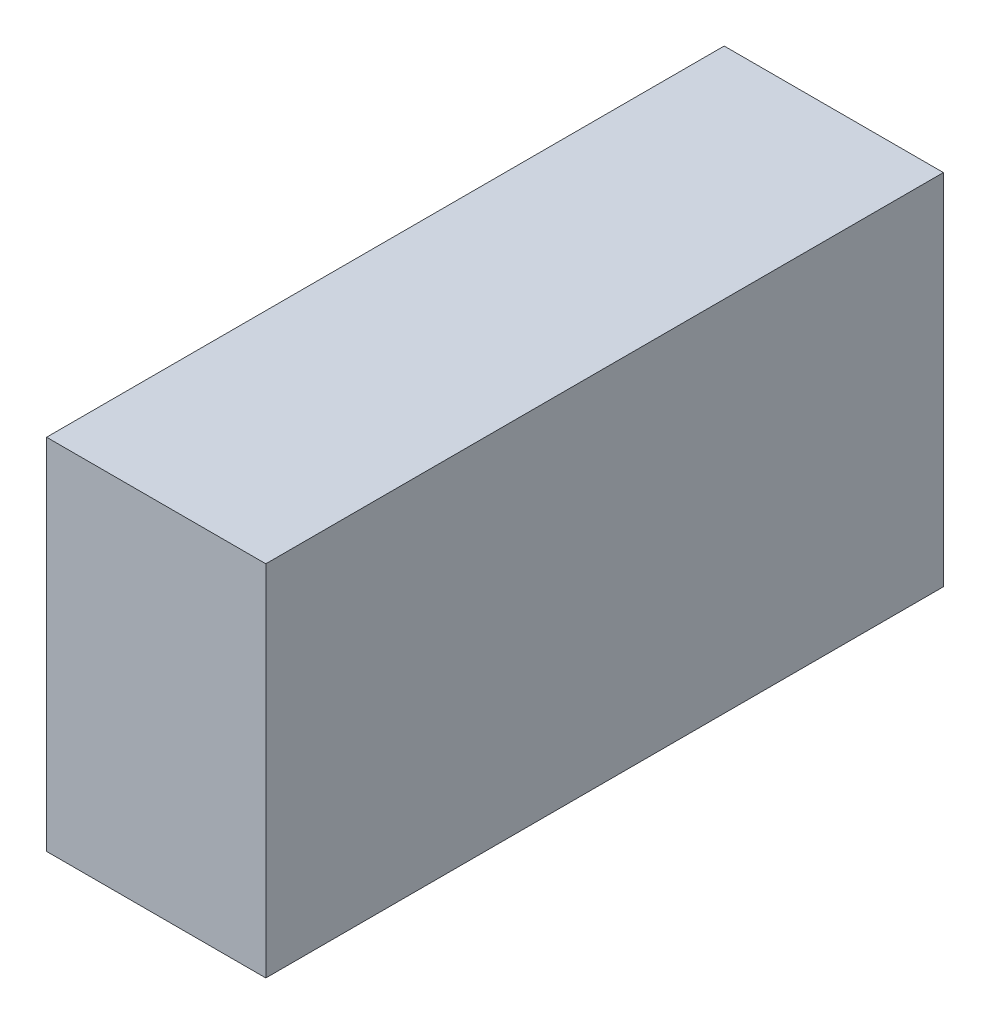
ISO-10303-21;
HEADER;
FILE_DESCRIPTION(('STEP AP214'),'2;1');
FILE_NAME('part.step','',(''),(''),'','','');
FILE_SCHEMA(('AUTOMOTIVE_DESIGN { 1 0 10303 214 1 1 1 1 }'));
ENDSEC;
DATA;
#1=APPLICATION_CONTEXT('core data for automotive mechanical design processes');
#2=APPLICATION_PROTOCOL_DEFINITION('international standard','automotive_design',2000,#1);
#3=PRODUCT_CONTEXT('',#1,'mechanical');
#4=PRODUCT('Part','Part','',(#3));
#5=PRODUCT_RELATED_PRODUCT_CATEGORY('part','',(#4));
#6=PRODUCT_DEFINITION_FORMATION('','',#4);
#7=PRODUCT_DEFINITION_CONTEXT('part definition',#1,'design');
#8=PRODUCT_DEFINITION('design','',#6,#7);
#9=PRODUCT_DEFINITION_SHAPE('','',#8);
#10=(LENGTH_UNIT() NAMED_UNIT(*) SI_UNIT(.MILLI.,.METRE.));
#11=(NAMED_UNIT(*) PLANE_ANGLE_UNIT() SI_UNIT($,.RADIAN.));
#12=(NAMED_UNIT(*) SI_UNIT($,.STERADIAN.) SOLID_ANGLE_UNIT());
#13=UNCERTAINTY_MEASURE_WITH_UNIT(LENGTH_MEASURE(1.E-05),#10,'distance_accuracy_value','');
#14=(GEOMETRIC_REPRESENTATION_CONTEXT(3) GLOBAL_UNCERTAINTY_ASSIGNED_CONTEXT((#13)) GLOBAL_UNIT_ASSIGNED_CONTEXT((#10,
#11,#12)) REPRESENTATION_CONTEXT('',''));
#15=CARTESIAN_POINT('',(0.,0.,0.));
#16=DIRECTION('',(0.,0.,1.));
#17=DIRECTION('',(1.,0.,0.));
#18=AXIS2_PLACEMENT_3D('',#15,#16,#17);
#19=CARTESIAN_POINT('',(28.,23.,-3.));
#20=DIRECTION('',(0.,0.,-1.));
#21=DIRECTION('',(-1.,0.,0.));
#22=AXIS2_PLACEMENT_3D('',#19,#20,#21);
#23=PLANE('',#22);
#24=DIRECTION('',(0.,-1.,0.));
#25=VECTOR('',#24,1.);
#26=CARTESIAN_POINT('',(17.,23.,-3.));
#27=LINE('',#26,#25);
#28=CARTESIAN_POINT('',(17.,23.,-3.));
#29=VERTEX_POINT('',#28);
#30=CARTESIAN_POINT('',(17.,5.,-3.));
#31=VERTEX_POINT('',#30);
#32=EDGE_CURVE('E104',#29,#31,#27,.T.);
#33=ORIENTED_EDGE('',*,*,#32,.T.);
#34=DIRECTION('',(-1.,0.,0.));
#35=VECTOR('',#34,1.);
#36=CARTESIAN_POINT('',(28.,5.,-3.));
#37=LINE('',#36,#35);
#38=CARTESIAN_POINT('',(28.,5.,-3.));
#39=VERTEX_POINT('',#38);
#40=EDGE_CURVE('E11',#39,#31,#37,.T.);
#41=ORIENTED_EDGE('',*,*,#40,.F.);
#42=DIRECTION('',(0.,-1.,0.));
#43=VECTOR('',#42,1.);
#44=CARTESIAN_POINT('',(28.,23.,-3.));
#45=LINE('',#44,#43);
#46=CARTESIAN_POINT('',(28.,23.,-3.));
#47=VERTEX_POINT('',#46);
#48=EDGE_CURVE('E92',#47,#39,#45,.T.);
#49=ORIENTED_EDGE('',*,*,#48,.F.);
#50=DIRECTION('',(-1.,0.,0.));
#51=VECTOR('',#50,1.);
#52=CARTESIAN_POINT('',(28.,23.,-3.));
#53=LINE('',#52,#51);
#54=EDGE_CURVE('E100',#47,#29,#53,.T.);
#55=ORIENTED_EDGE('',*,*,#54,.T.);
#56=EDGE_LOOP('',(#33,#41,#49,#55));
#57=FACE_BOUND('',#56,.T.);
#58=ADVANCED_FACE('F41',(#57),#23,.F.);
#59=CARTESIAN_POINT('',(28.,5.,-3.));
#60=DIRECTION('',(0.,1.,0.));
#61=DIRECTION('',(0.,0.,1.));
#62=AXIS2_PLACEMENT_3D('',#59,#60,#61);
#63=PLANE('',#62);
#64=DIRECTION('',(0.,0.,-1.));
#65=VECTOR('',#64,1.);
#66=CARTESIAN_POINT('',(17.,5.,-3.));
#67=LINE('',#66,#65);
#68=CARTESIAN_POINT('',(17.,5.,-37.));
#69=VERTEX_POINT('',#68);
#70=EDGE_CURVE('E96',#31,#69,#67,.T.);
#71=ORIENTED_EDGE('',*,*,#70,.T.);
#72=DIRECTION('',(-1.,0.,0.));
#73=VECTOR('',#72,1.);
#74=CARTESIAN_POINT('',(28.,5.,-37.));
#75=LINE('',#74,#73);
#76=CARTESIAN_POINT('',(28.,5.,-37.));
#77=VERTEX_POINT('',#76);
#78=EDGE_CURVE('E49',#77,#69,#75,.T.);
#79=ORIENTED_EDGE('',*,*,#78,.F.);
#80=DIRECTION('',(0.,0.,-1.));
#81=VECTOR('',#80,1.);
#82=CARTESIAN_POINT('',(28.,5.,-3.));
#83=LINE('',#82,#81);
#84=EDGE_CURVE('E87',#39,#77,#83,.T.);
#85=ORIENTED_EDGE('',*,*,#84,.F.);
#86=ORIENTED_EDGE('',*,*,#40,.T.);
#87=EDGE_LOOP('',(#71,#79,#85,#86));
#88=FACE_BOUND('',#87,.T.);
#89=ADVANCED_FACE('F95',(#88),#63,.F.);
#90=CARTESIAN_POINT('',(28.,5.,-37.));
#91=DIRECTION('',(0.,0.,1.));
#92=DIRECTION('',(1.,0.,0.));
#93=AXIS2_PLACEMENT_3D('',#90,#91,#92);
#94=PLANE('',#93);
#95=DIRECTION('',(0.,1.,0.));
#96=VECTOR('',#95,1.);
#97=CARTESIAN_POINT('',(17.,5.,-37.));
#98=LINE('',#97,#96);
#99=CARTESIAN_POINT('',(17.,23.,-37.));
#100=VERTEX_POINT('',#99);
#101=EDGE_CURVE('E74',#69,#100,#98,.T.);
#102=ORIENTED_EDGE('',*,*,#101,.T.);
#103=DIRECTION('',(-1.,0.,0.));
#104=VECTOR('',#103,1.);
#105=CARTESIAN_POINT('',(28.,23.,-37.));
#106=LINE('',#105,#104);
#107=CARTESIAN_POINT('',(28.,23.,-37.));
#108=VERTEX_POINT('',#107);
#109=EDGE_CURVE('E97',#108,#100,#106,.T.);
#110=ORIENTED_EDGE('',*,*,#109,.F.);
#111=DIRECTION('',(0.,1.,0.));
#112=VECTOR('',#111,1.);
#113=CARTESIAN_POINT('',(28.,5.,-37.));
#114=LINE('',#113,#112);
#115=EDGE_CURVE('E90',#77,#108,#114,.T.);
#116=ORIENTED_EDGE('',*,*,#115,.F.);
#117=ORIENTED_EDGE('',*,*,#78,.T.);
#118=EDGE_LOOP('',(#102,#110,#116,#117));
#119=FACE_BOUND('',#118,.T.);
#120=ADVANCED_FACE('F98',(#119),#94,.F.);
#121=CARTESIAN_POINT('',(28.,23.,-37.));
#122=DIRECTION('',(0.,-1.,0.));
#123=DIRECTION('',(0.,0.,-1.));
#124=AXIS2_PLACEMENT_3D('',#121,#122,#123);
#125=PLANE('',#124);
#126=DIRECTION('',(0.,0.,1.));
#127=VECTOR('',#126,1.);
#128=CARTESIAN_POINT('',(17.,23.,-37.));
#129=LINE('',#128,#127);
#130=EDGE_CURVE('E80',#100,#29,#129,.T.);
#131=ORIENTED_EDGE('',*,*,#130,.T.);
#132=ORIENTED_EDGE('',*,*,#54,.F.);
#133=DIRECTION('',(0.,0.,1.));
#134=VECTOR('',#133,1.);
#135=CARTESIAN_POINT('',(28.,23.,-37.));
#136=LINE('',#135,#134);
#137=EDGE_CURVE('E57',#108,#47,#136,.T.);
#138=ORIENTED_EDGE('',*,*,#137,.F.);
#139=ORIENTED_EDGE('',*,*,#109,.T.);
#140=EDGE_LOOP('',(#131,#132,#138,#139));
#141=FACE_BOUND('',#140,.T.);
#142=ADVANCED_FACE('F111',(#141),#125,.F.);
#143=CARTESIAN_POINT('',(28.,0.,0.));
#144=DIRECTION('',(1.,0.,0.));
#145=DIRECTION('',(0.,0.,-1.));
#146=AXIS2_PLACEMENT_3D('',#143,#144,#145);
#147=PLANE('',#146);
#148=ORIENTED_EDGE('',*,*,#48,.T.);
#149=ORIENTED_EDGE('',*,*,#84,.T.);
#150=ORIENTED_EDGE('',*,*,#115,.T.);
#151=ORIENTED_EDGE('',*,*,#137,.T.);
#152=EDGE_LOOP('',(#148,#149,#150,#151));
#153=FACE_BOUND('',#152,.T.);
#154=ADVANCED_FACE('F88',(#153),#147,.T.);
#155=CARTESIAN_POINT('',(17.,0.,0.));
#156=DIRECTION('',(1.,0.,0.));
#157=DIRECTION('',(0.,0.,-1.));
#158=AXIS2_PLACEMENT_3D('',#155,#156,#157);
#159=PLANE('',#158);
#160=ORIENTED_EDGE('',*,*,#32,.F.);
#161=ORIENTED_EDGE('',*,*,#130,.F.);
#162=ORIENTED_EDGE('',*,*,#101,.F.);
#163=ORIENTED_EDGE('',*,*,#70,.F.);
#164=EDGE_LOOP('',(#160,#161,#162,#163));
#165=FACE_BOUND('',#164,.T.);
#166=ADVANCED_FACE('F114',(#165),#159,.F.);
#167=CLOSED_SHELL('',(#58,#89,#120,#142,#154,#166));
#168=MANIFOLD_SOLID_BREP('B2',#167);
#169=ADVANCED_BREP_SHAPE_REPRESENTATION('',(#18,#168),#14);
#170=SHAPE_DEFINITION_REPRESENTATION(#9,#169);
ENDSEC;
END-ISO-10303-21;
